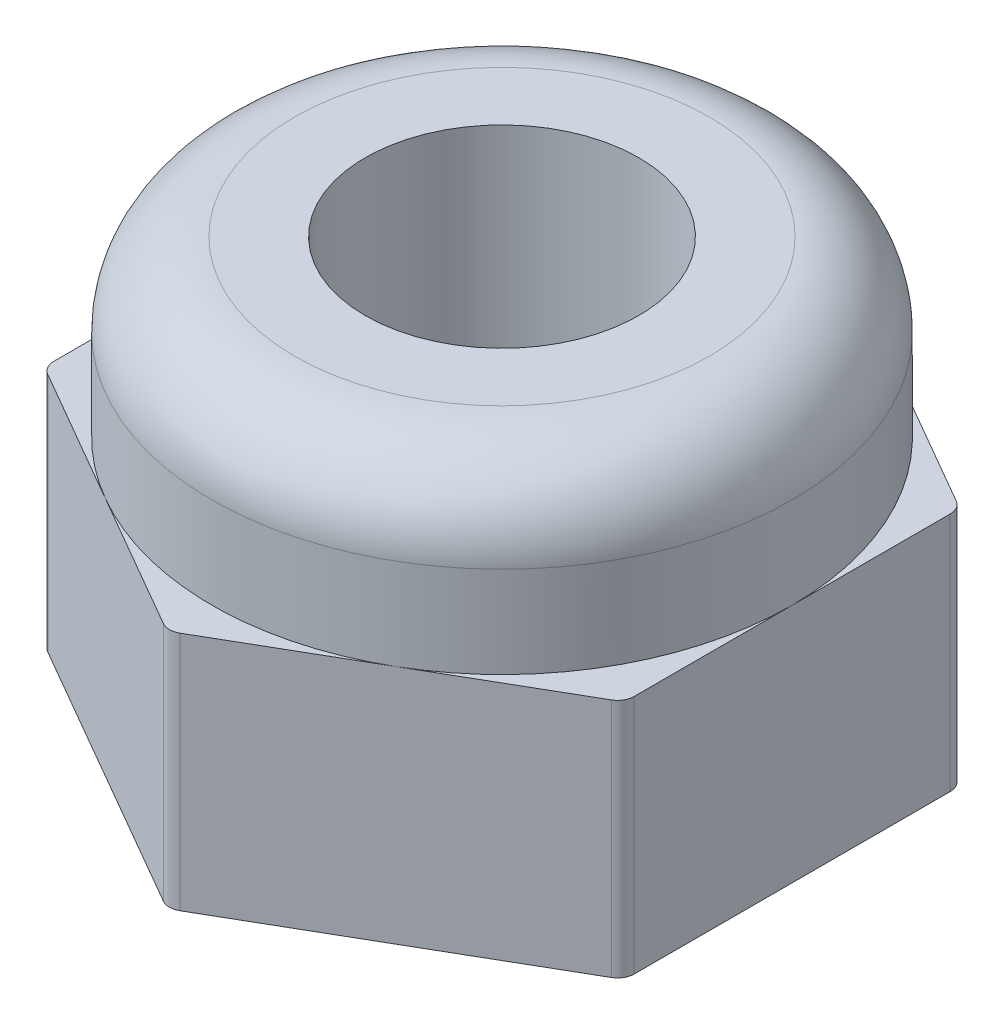
ISO-10303-21;
HEADER;
FILE_DESCRIPTION(('STEP AP214'),'2;1');
FILE_NAME('part.step','',(''),(''),'','','');
FILE_SCHEMA(('AUTOMOTIVE_DESIGN { 1 0 10303 214 1 1 1 1 }'));
ENDSEC;
DATA;
#1=APPLICATION_CONTEXT('core data for automotive mechanical design processes');
#2=APPLICATION_PROTOCOL_DEFINITION('international standard','automotive_design',2000,#1);
#3=PRODUCT_CONTEXT('',#1,'mechanical');
#4=PRODUCT('Part','Part','',(#3));
#5=PRODUCT_RELATED_PRODUCT_CATEGORY('part','',(#4));
#6=PRODUCT_DEFINITION_FORMATION('','',#4);
#7=PRODUCT_DEFINITION_CONTEXT('part definition',#1,'design');
#8=PRODUCT_DEFINITION('design','',#6,#7);
#9=PRODUCT_DEFINITION_SHAPE('','',#8);
#10=(LENGTH_UNIT() NAMED_UNIT(*) SI_UNIT(.MILLI.,.METRE.));
#11=(NAMED_UNIT(*) PLANE_ANGLE_UNIT() SI_UNIT($,.RADIAN.));
#12=(NAMED_UNIT(*) SI_UNIT($,.STERADIAN.) SOLID_ANGLE_UNIT());
#13=UNCERTAINTY_MEASURE_WITH_UNIT(LENGTH_MEASURE(1.E-05),#10,'distance_accuracy_value','');
#14=(GEOMETRIC_REPRESENTATION_CONTEXT(3) GLOBAL_UNCERTAINTY_ASSIGNED_CONTEXT((#13)) GLOBAL_UNIT_ASSIGNED_CONTEXT((#10,
#11,#12)) REPRESENTATION_CONTEXT('',''));
#15=CARTESIAN_POINT('',(0.,0.,0.));
#16=DIRECTION('',(0.,0.,1.));
#17=DIRECTION('',(1.,0.,0.));
#18=AXIS2_PLACEMENT_3D('',#15,#16,#17);
#19=CARTESIAN_POINT('',(0.,2.9,0.));
#20=DIRECTION('',(0.,1.,0.));
#21=DIRECTION('',(0.,0.,1.));
#22=AXIS2_PLACEMENT_3D('',#19,#20,#21);
#23=PLANE('',#22);
#24=DIRECTION('',(0.866025403784439,0.,-0.5));
#25=VECTOR('',#24,1.);
#26=CARTESIAN_POINT('',(0.,2.9,4.04145188432738));
#27=LINE('',#26,#25);
#28=CARTESIAN_POINT('',(1.75,2.9,3.03108891324554));
#29=VERTEX_POINT('',#28);
#30=CARTESIAN_POINT('',(3.4,2.9,2.07846096908265));
#31=VERTEX_POINT('',#30);
#32=EDGE_CURVE('E165',#29,#31,#27,.T.);
#33=ORIENTED_EDGE('',*,*,#32,.T.);
#34=CARTESIAN_POINT('',(3.3,2.9,1.90525588832577));
#35=DIRECTION('',(0.,1.,0.));
#36=DIRECTION('',(0.,0.,1.));
#37=AXIS2_PLACEMENT_3D('',#34,#35,#36);
#38=CIRCLE('',#37,0.2);
#39=CARTESIAN_POINT('',(3.5,2.9,1.90525588832577));
#40=VERTEX_POINT('',#39);
#41=EDGE_CURVE('E309',#31,#40,#38,.T.);
#42=ORIENTED_EDGE('',*,*,#41,.T.);
#43=DIRECTION('',(0.,0.,-1.));
#44=VECTOR('',#43,1.);
#45=CARTESIAN_POINT('',(3.5,2.9,2.02072594216369));
#46=LINE('',#45,#44);
#47=CARTESIAN_POINT('',(3.5,2.9,0.));
#48=VERTEX_POINT('',#47);
#49=EDGE_CURVE('E180',#40,#48,#46,.T.);
#50=ORIENTED_EDGE('',*,*,#49,.T.);
#51=CARTESIAN_POINT('',(0.,2.9,0.));
#52=DIRECTION('',(0.,1.,0.));
#53=DIRECTION('',(0.,0.,1.));
#54=AXIS2_PLACEMENT_3D('',#51,#52,#53);
#55=CIRCLE('',#54,3.5);
#56=EDGE_CURVE('E178',#29,#48,#55,.T.);
#57=ORIENTED_EDGE('',*,*,#56,.F.);
#58=EDGE_LOOP('',(#33,#42,#50,#57));
#59=FACE_BOUND('',#58,.T.);
#60=ADVANCED_FACE('F45',(#59),#23,.T.);
#61=CARTESIAN_POINT('',(3.5,2.9,-1.90525588832576));
#62=VERTEX_POINT('',#61);
#63=EDGE_CURVE('E164',#48,#62,#46,.T.);
#64=ORIENTED_EDGE('',*,*,#63,.T.);
#65=CARTESIAN_POINT('',(3.3,2.9,-1.90525588832576));
#66=DIRECTION('',(0.,1.,0.));
#67=DIRECTION('',(0.,0.,1.));
#68=AXIS2_PLACEMENT_3D('',#65,#66,#67);
#69=CIRCLE('',#68,0.2);
#70=CARTESIAN_POINT('',(3.4,2.9,-2.07846096908265));
#71=VERTEX_POINT('',#70);
#72=EDGE_CURVE('E301',#62,#71,#69,.T.);
#73=ORIENTED_EDGE('',*,*,#72,.T.);
#74=DIRECTION('',(-0.866025403784439,0.,-0.5));
#75=VECTOR('',#74,1.);
#76=CARTESIAN_POINT('',(3.5,2.9,-2.02072594216369));
#77=LINE('',#76,#75);
#78=CARTESIAN_POINT('',(1.75,2.9,-3.03108891324554));
#79=VERTEX_POINT('',#78);
#80=EDGE_CURVE('E206',#71,#79,#77,.T.);
#81=ORIENTED_EDGE('',*,*,#80,.T.);
#82=EDGE_CURVE('E186',#48,#79,#55,.T.);
#83=ORIENTED_EDGE('',*,*,#82,.F.);
#84=EDGE_LOOP('',(#64,#73,#81,#83));
#85=FACE_BOUND('',#84,.T.);
#86=ADVANCED_FACE('F372',(#85),#23,.T.);
#87=CARTESIAN_POINT('',(0.099999999999999,2.9,-3.98371685740842));
#88=VERTEX_POINT('',#87);
#89=EDGE_CURVE('E205',#79,#88,#77,.T.);
#90=ORIENTED_EDGE('',*,*,#89,.T.);
#91=CARTESIAN_POINT('',(0.,2.9,-3.81051177665153));
#92=DIRECTION('',(0.,1.,0.));
#93=DIRECTION('',(0.,0.,1.));
#94=AXIS2_PLACEMENT_3D('',#91,#92,#93);
#95=CIRCLE('',#94,0.2);
#96=CARTESIAN_POINT('',(-0.100000000000001,2.9,-3.98371685740842));
#97=VERTEX_POINT('',#96);
#98=EDGE_CURVE('E291',#88,#97,#95,.T.);
#99=ORIENTED_EDGE('',*,*,#98,.T.);
#100=DIRECTION('',(-0.866025403784439,0.,0.5));
#101=VECTOR('',#100,1.);
#102=CARTESIAN_POINT('',(0.,2.9,-4.04145188432738));
#103=LINE('',#102,#101);
#104=CARTESIAN_POINT('',(-1.75,2.9,-3.03108891324554));
#105=VERTEX_POINT('',#104);
#106=EDGE_CURVE('E210',#97,#105,#103,.T.);
#107=ORIENTED_EDGE('',*,*,#106,.T.);
#108=EDGE_CURVE('E328',#79,#105,#55,.T.);
#109=ORIENTED_EDGE('',*,*,#108,.F.);
#110=EDGE_LOOP('',(#90,#99,#107,#109));
#111=FACE_BOUND('',#110,.T.);
#112=ADVANCED_FACE('F386',(#111),#23,.T.);
#113=CARTESIAN_POINT('',(-3.4,2.9,-2.07846096908265));
#114=VERTEX_POINT('',#113);
#115=EDGE_CURVE('E209',#105,#114,#103,.T.);
#116=ORIENTED_EDGE('',*,*,#115,.T.);
#117=CARTESIAN_POINT('',(-3.3,2.9,-1.90525588832577));
#118=DIRECTION('',(0.,1.,0.));
#119=DIRECTION('',(0.,0.,1.));
#120=AXIS2_PLACEMENT_3D('',#117,#118,#119);
#121=CIRCLE('',#120,0.2);
#122=CARTESIAN_POINT('',(-3.5,2.9,-1.90525588832577));
#123=VERTEX_POINT('',#122);
#124=EDGE_CURVE('E281',#114,#123,#121,.T.);
#125=ORIENTED_EDGE('',*,*,#124,.T.);
#126=DIRECTION('',(0.,0.,1.));
#127=VECTOR('',#126,1.);
#128=CARTESIAN_POINT('',(-3.5,2.9,-2.02072594216369));
#129=LINE('',#128,#127);
#130=CARTESIAN_POINT('',(-3.5,2.9,0.));
#131=VERTEX_POINT('',#130);
#132=EDGE_CURVE('E214',#123,#131,#129,.T.);
#133=ORIENTED_EDGE('',*,*,#132,.T.);
#134=EDGE_CURVE('E197',#105,#131,#55,.T.);
#135=ORIENTED_EDGE('',*,*,#134,.F.);
#136=EDGE_LOOP('',(#116,#125,#133,#135));
#137=FACE_BOUND('',#136,.T.);
#138=ADVANCED_FACE('F335',(#137),#23,.T.);
#139=CARTESIAN_POINT('',(-3.5,2.9,1.90525588832576));
#140=VERTEX_POINT('',#139);
#141=EDGE_CURVE('E213',#131,#140,#129,.T.);
#142=ORIENTED_EDGE('',*,*,#141,.T.);
#143=CARTESIAN_POINT('',(-3.3,2.9,1.90525588832576));
#144=DIRECTION('',(0.,1.,0.));
#145=DIRECTION('',(0.,0.,1.));
#146=AXIS2_PLACEMENT_3D('',#143,#144,#145);
#147=CIRCLE('',#146,0.2);
#148=CARTESIAN_POINT('',(-3.4,2.9,2.07846096908265));
#149=VERTEX_POINT('',#148);
#150=EDGE_CURVE('E11',#140,#149,#147,.T.);
#151=ORIENTED_EDGE('',*,*,#150,.T.);
#152=DIRECTION('',(0.866025403784439,0.,0.5));
#153=VECTOR('',#152,1.);
#154=CARTESIAN_POINT('',(-3.5,2.9,2.02072594216369));
#155=LINE('',#154,#153);
#156=CARTESIAN_POINT('',(-1.75,2.9,3.03108891324554));
#157=VERTEX_POINT('',#156);
#158=EDGE_CURVE('E218',#149,#157,#155,.T.);
#159=ORIENTED_EDGE('',*,*,#158,.T.);
#160=EDGE_CURVE('E192',#131,#157,#55,.T.);
#161=ORIENTED_EDGE('',*,*,#160,.F.);
#162=EDGE_LOOP('',(#142,#151,#159,#161));
#163=FACE_BOUND('',#162,.T.);
#164=ADVANCED_FACE('F352',(#163),#23,.T.);
#165=CARTESIAN_POINT('',(0.,2.9,4.04145188432738));
#166=DIRECTION('',(-0.5,0.,-0.866025403784439));
#167=DIRECTION('',(-0.866025403784439,0.,0.5));
#168=AXIS2_PLACEMENT_3D('',#165,#166,#167);
#169=PLANE('',#168);
#170=DIRECTION('',(0.866025403784439,0.,-0.5));
#171=VECTOR('',#170,1.);
#172=CARTESIAN_POINT('',(0.,0.,4.04145188432738));
#173=LINE('',#172,#171);
#174=CARTESIAN_POINT('',(0.0999999999999998,0.,3.98371685740842));
#175=VERTEX_POINT('',#174);
#176=CARTESIAN_POINT('',(3.4,0.,2.07846096908265));
#177=VERTEX_POINT('',#176);
#178=EDGE_CURVE('E185',#175,#177,#173,.T.);
#179=ORIENTED_EDGE('',*,*,#178,.T.);
#180=DIRECTION('',(0.,-1.,0.));
#181=VECTOR('',#180,1.);
#182=CARTESIAN_POINT('',(3.4,2.9,2.07846096908265));
#183=LINE('',#182,#181);
#184=EDGE_CURVE('E172',#177,#31,#183,.F.);
#185=ORIENTED_EDGE('',*,*,#184,.T.);
#186=ORIENTED_EDGE('',*,*,#32,.F.);
#187=CARTESIAN_POINT('',(0.0999999999999998,2.9,3.98371685740842));
#188=VERTEX_POINT('',#187);
#189=EDGE_CURVE('E154',#188,#29,#27,.T.);
#190=ORIENTED_EDGE('',*,*,#189,.F.);
#191=DIRECTION('',(0.,-1.,0.));
#192=VECTOR('',#191,1.);
#193=CARTESIAN_POINT('',(0.0999999999999998,2.9,3.98371685740842));
#194=LINE('',#193,#192);
#195=EDGE_CURVE('E304',#188,#175,#194,.T.);
#196=ORIENTED_EDGE('',*,*,#195,.T.);
#197=EDGE_LOOP('',(#179,#185,#186,#190,#196));
#198=FACE_BOUND('',#197,.T.);
#199=ADVANCED_FACE('F170',(#198),#169,.F.);
#200=CARTESIAN_POINT('',(3.5,2.9,2.02072594216369));
#201=DIRECTION('',(-1.,0.,0.));
#202=DIRECTION('',(0.,0.,1.));
#203=AXIS2_PLACEMENT_3D('',#200,#201,#202);
#204=PLANE('',#203);
#205=DIRECTION('',(0.,0.,-1.));
#206=VECTOR('',#205,1.);
#207=CARTESIAN_POINT('',(3.5,0.,2.02072594216369));
#208=LINE('',#207,#206);
#209=CARTESIAN_POINT('',(3.5,0.,1.90525588832577));
#210=VERTEX_POINT('',#209);
#211=CARTESIAN_POINT('',(3.5,0.,-1.90525588832576));
#212=VERTEX_POINT('',#211);
#213=EDGE_CURVE('E224',#210,#212,#208,.T.);
#214=ORIENTED_EDGE('',*,*,#213,.T.);
#215=DIRECTION('',(0.,-1.,0.));
#216=VECTOR('',#215,1.);
#217=CARTESIAN_POINT('',(3.5,2.9,-1.90525588832576));
#218=LINE('',#217,#216);
#219=EDGE_CURVE('E298',#212,#62,#218,.F.);
#220=ORIENTED_EDGE('',*,*,#219,.T.);
#221=ORIENTED_EDGE('',*,*,#63,.F.);
#222=ORIENTED_EDGE('',*,*,#49,.F.);
#223=DIRECTION('',(0.,-1.,0.));
#224=VECTOR('',#223,1.);
#225=CARTESIAN_POINT('',(3.5,2.9,1.90525588832577));
#226=LINE('',#225,#224);
#227=EDGE_CURVE('E294',#40,#210,#226,.T.);
#228=ORIENTED_EDGE('',*,*,#227,.T.);
#229=EDGE_LOOP('',(#214,#220,#221,#222,#228));
#230=FACE_BOUND('',#229,.T.);
#231=ADVANCED_FACE('F367',(#230),#204,.F.);
#232=CARTESIAN_POINT('',(3.5,2.9,-2.02072594216369));
#233=DIRECTION('',(-0.5,0.,0.866025403784439));
#234=DIRECTION('',(0.866025403784439,0.,0.5));
#235=AXIS2_PLACEMENT_3D('',#232,#233,#234);
#236=PLANE('',#235);
#237=DIRECTION('',(-0.866025403784439,0.,-0.5));
#238=VECTOR('',#237,1.);
#239=CARTESIAN_POINT('',(3.5,0.,-2.02072594216369));
#240=LINE('',#239,#238);
#241=CARTESIAN_POINT('',(3.4,0.,-2.07846096908265));
#242=VERTEX_POINT('',#241);
#243=CARTESIAN_POINT('',(0.099999999999999,0.,-3.98371685740842));
#244=VERTEX_POINT('',#243);
#245=EDGE_CURVE('E228',#242,#244,#240,.T.);
#246=ORIENTED_EDGE('',*,*,#245,.T.);
#247=DIRECTION('',(0.,-1.,0.));
#248=VECTOR('',#247,1.);
#249=CARTESIAN_POINT('',(0.099999999999999,2.9,-3.98371685740842));
#250=LINE('',#249,#248);
#251=EDGE_CURVE('E288',#244,#88,#250,.F.);
#252=ORIENTED_EDGE('',*,*,#251,.T.);
#253=ORIENTED_EDGE('',*,*,#89,.F.);
#254=ORIENTED_EDGE('',*,*,#80,.F.);
#255=DIRECTION('',(0.,-1.,0.));
#256=VECTOR('',#255,1.);
#257=CARTESIAN_POINT('',(3.4,2.9,-2.07846096908265));
#258=LINE('',#257,#256);
#259=EDGE_CURVE('E284',#71,#242,#258,.T.);
#260=ORIENTED_EDGE('',*,*,#259,.T.);
#261=EDGE_LOOP('',(#246,#252,#253,#254,#260));
#262=FACE_BOUND('',#261,.T.);
#263=ADVANCED_FACE('F379',(#262),#236,.F.);
#264=CARTESIAN_POINT('',(0.,2.9,-4.04145188432738));
#265=DIRECTION('',(0.5,0.,0.866025403784439));
#266=DIRECTION('',(0.866025403784439,0.,-0.5));
#267=AXIS2_PLACEMENT_3D('',#264,#265,#266);
#268=PLANE('',#267);
#269=DIRECTION('',(-0.866025403784439,0.,0.5));
#270=VECTOR('',#269,1.);
#271=CARTESIAN_POINT('',(0.,0.,-4.04145188432738));
#272=LINE('',#271,#270);
#273=CARTESIAN_POINT('',(-0.100000000000001,0.,-3.98371685740842));
#274=VERTEX_POINT('',#273);
#275=CARTESIAN_POINT('',(-3.4,0.,-2.07846096908265));
#276=VERTEX_POINT('',#275);
#277=EDGE_CURVE('E232',#274,#276,#272,.T.);
#278=ORIENTED_EDGE('',*,*,#277,.T.);
#279=DIRECTION('',(0.,-1.,0.));
#280=VECTOR('',#279,1.);
#281=CARTESIAN_POINT('',(-3.4,2.9,-2.07846096908265));
#282=LINE('',#281,#280);
#283=EDGE_CURVE('E278',#276,#114,#282,.F.);
#284=ORIENTED_EDGE('',*,*,#283,.T.);
#285=ORIENTED_EDGE('',*,*,#115,.F.);
#286=ORIENTED_EDGE('',*,*,#106,.F.);
#287=DIRECTION('',(0.,-1.,0.));
#288=VECTOR('',#287,1.);
#289=CARTESIAN_POINT('',(-0.100000000000001,2.9,-3.98371685740842));
#290=LINE('',#289,#288);
#291=EDGE_CURVE('E274',#97,#274,#290,.T.);
#292=ORIENTED_EDGE('',*,*,#291,.T.);
#293=EDGE_LOOP('',(#278,#284,#285,#286,#292));
#294=FACE_BOUND('',#293,.T.);
#295=ADVANCED_FACE('F340',(#294),#268,.F.);
#296=CARTESIAN_POINT('',(-3.5,2.9,-2.02072594216369));
#297=DIRECTION('',(1.,0.,0.));
#298=DIRECTION('',(0.,0.,-1.));
#299=AXIS2_PLACEMENT_3D('',#296,#297,#298);
#300=PLANE('',#299);
#301=ORIENTED_EDGE('',*,*,#132,.F.);
#302=DIRECTION('',(0.,-1.,0.));
#303=VECTOR('',#302,1.);
#304=CARTESIAN_POINT('',(-3.5,2.9,-1.90525588832577));
#305=LINE('',#304,#303);
#306=CARTESIAN_POINT('',(-3.5,0.,-1.90525588832577));
#307=VERTEX_POINT('',#306);
#308=EDGE_CURVE('E252',#123,#307,#305,.T.);
#309=ORIENTED_EDGE('',*,*,#308,.T.);
#310=DIRECTION('',(0.,0.,1.));
#311=VECTOR('',#310,1.);
#312=CARTESIAN_POINT('',(-3.5,0.,-2.02072594216369));
#313=LINE('',#312,#311);
#314=CARTESIAN_POINT('',(-3.5,0.,1.90525588832576));
#315=VERTEX_POINT('',#314);
#316=EDGE_CURVE('E236',#307,#315,#313,.T.);
#317=ORIENTED_EDGE('',*,*,#316,.T.);
#318=DIRECTION('',(0.,-1.,0.));
#319=VECTOR('',#318,1.);
#320=CARTESIAN_POINT('',(-3.5,2.9,1.90525588832576));
#321=LINE('',#320,#319);
#322=EDGE_CURVE('E249',#315,#140,#321,.F.);
#323=ORIENTED_EDGE('',*,*,#322,.T.);
#324=ORIENTED_EDGE('',*,*,#141,.F.);
#325=EDGE_LOOP('',(#301,#309,#317,#323,#324));
#326=FACE_BOUND('',#325,.T.);
#327=ADVANCED_FACE('F349',(#326),#300,.F.);
#328=CARTESIAN_POINT('',(-3.5,2.9,2.02072594216369));
#329=DIRECTION('',(0.5,0.,-0.866025403784439));
#330=DIRECTION('',(-0.866025403784439,0.,-0.5));
#331=AXIS2_PLACEMENT_3D('',#328,#329,#330);
#332=PLANE('',#331);
#333=DIRECTION('',(0.866025403784439,0.,0.5));
#334=VECTOR('',#333,1.);
#335=CARTESIAN_POINT('',(-3.5,0.,2.02072594216369));
#336=LINE('',#335,#334);
#337=CARTESIAN_POINT('',(-3.4,0.,2.07846096908265));
#338=VERTEX_POINT('',#337);
#339=CARTESIAN_POINT('',(-0.0999999999999985,0.,3.98371685740842));
#340=VERTEX_POINT('',#339);
#341=EDGE_CURVE('E176',#338,#340,#336,.T.);
#342=ORIENTED_EDGE('',*,*,#341,.T.);
#343=DIRECTION('',(0.,-1.,0.));
#344=VECTOR('',#343,1.);
#345=CARTESIAN_POINT('',(-0.1,2.9,3.98371685740842));
#346=LINE('',#345,#344);
#347=CARTESIAN_POINT('',(-0.0999999999999985,2.9,3.98371685740842));
#348=VERTEX_POINT('',#347);
#349=EDGE_CURVE('E67',#340,#348,#346,.F.);
#350=ORIENTED_EDGE('',*,*,#349,.T.);
#351=EDGE_CURVE('E217',#157,#348,#155,.T.);
#352=ORIENTED_EDGE('',*,*,#351,.F.);
#353=ORIENTED_EDGE('',*,*,#158,.F.);
#354=DIRECTION('',(0.,-1.,0.));
#355=VECTOR('',#354,1.);
#356=CARTESIAN_POINT('',(-3.4,2.9,2.07846096908265));
#357=LINE('',#356,#355);
#358=EDGE_CURVE('E312',#149,#338,#357,.T.);
#359=ORIENTED_EDGE('',*,*,#358,.T.);
#360=EDGE_LOOP('',(#342,#350,#352,#353,#359));
#361=FACE_BOUND('',#360,.T.);
#362=ADVANCED_FACE('F356',(#361),#332,.F.);
#363=ORIENTED_EDGE('',*,*,#351,.T.);
#364=CARTESIAN_POINT('',(0.,2.9,3.81051177665153));
#365=DIRECTION('',(0.,1.,0.));
#366=DIRECTION('',(0.,0.,1.));
#367=AXIS2_PLACEMENT_3D('',#364,#365,#366);
#368=CIRCLE('',#367,0.2);
#369=EDGE_CURVE('E54',#348,#188,#368,.T.);
#370=ORIENTED_EDGE('',*,*,#369,.T.);
#371=ORIENTED_EDGE('',*,*,#189,.T.);
#372=EDGE_CURVE('E158',#157,#29,#55,.T.);
#373=ORIENTED_EDGE('',*,*,#372,.F.);
#374=EDGE_LOOP('',(#363,#370,#371,#373));
#375=FACE_BOUND('',#374,.T.);
#376=ADVANCED_FACE('F156',(#375),#23,.T.);
#377=CARTESIAN_POINT('',(0.,0.,0.));
#378=DIRECTION('',(0.,1.,0.));
#379=DIRECTION('',(0.,0.,1.));
#380=AXIS2_PLACEMENT_3D('',#377,#378,#379);
#381=PLANE('',#380);
#382=CARTESIAN_POINT('',(0.,0.,0.));
#383=DIRECTION('',(0.,-1.,0.));
#384=DIRECTION('',(0.,0.,-1.));
#385=AXIS2_PLACEMENT_3D('',#382,#383,#384);
#386=CIRCLE('',#385,1.64999999999999);
#387=CARTESIAN_POINT('',(0.,0.,-1.64999999999999));
#388=VERTEX_POINT('',#387);
#389=EDGE_CURVE('E199',#388,#388,#386,.T.);
#390=ORIENTED_EDGE('',*,*,#389,.F.);
#391=EDGE_LOOP('',(#390));
#392=FACE_BOUND('',#391,.T.);
#393=ORIENTED_EDGE('',*,*,#316,.F.);
#394=CARTESIAN_POINT('',(-3.3,0.,-1.90525588832577));
#395=DIRECTION('',(0.,1.,0.));
#396=DIRECTION('',(0.,0.,1.));
#397=AXIS2_PLACEMENT_3D('',#394,#395,#396);
#398=CIRCLE('',#397,0.2);
#399=EDGE_CURVE('E271',#307,#276,#398,.F.);
#400=ORIENTED_EDGE('',*,*,#399,.T.);
#401=ORIENTED_EDGE('',*,*,#277,.F.);
#402=CARTESIAN_POINT('',(0.,0.,-3.81051177665153));
#403=DIRECTION('',(0.,1.,0.));
#404=DIRECTION('',(0.,0.,1.));
#405=AXIS2_PLACEMENT_3D('',#402,#403,#404);
#406=CIRCLE('',#405,0.2);
#407=EDGE_CURVE('E268',#274,#244,#406,.F.);
#408=ORIENTED_EDGE('',*,*,#407,.T.);
#409=ORIENTED_EDGE('',*,*,#245,.F.);
#410=CARTESIAN_POINT('',(3.3,0.,-1.90525588832576));
#411=DIRECTION('',(0.,1.,0.));
#412=DIRECTION('',(0.,0.,1.));
#413=AXIS2_PLACEMENT_3D('',#410,#411,#412);
#414=CIRCLE('',#413,0.2);
#415=EDGE_CURVE('E265',#242,#212,#414,.F.);
#416=ORIENTED_EDGE('',*,*,#415,.T.);
#417=ORIENTED_EDGE('',*,*,#213,.F.);
#418=CARTESIAN_POINT('',(3.3,0.,1.90525588832577));
#419=DIRECTION('',(0.,1.,0.));
#420=DIRECTION('',(0.,0.,1.));
#421=AXIS2_PLACEMENT_3D('',#418,#419,#420);
#422=CIRCLE('',#421,0.2);
#423=EDGE_CURVE('E262',#210,#177,#422,.F.);
#424=ORIENTED_EDGE('',*,*,#423,.T.);
#425=ORIENTED_EDGE('',*,*,#178,.F.);
#426=CARTESIAN_POINT('',(0.,0.,3.81051177665153));
#427=DIRECTION('',(0.,1.,0.));
#428=DIRECTION('',(0.,0.,1.));
#429=AXIS2_PLACEMENT_3D('',#426,#427,#428);
#430=CIRCLE('',#429,0.2);
#431=EDGE_CURVE('E259',#175,#340,#430,.F.);
#432=ORIENTED_EDGE('',*,*,#431,.T.);
#433=ORIENTED_EDGE('',*,*,#341,.F.);
#434=CARTESIAN_POINT('',(-3.3,0.,1.90525588832576));
#435=DIRECTION('',(0.,1.,0.));
#436=DIRECTION('',(0.,0.,1.));
#437=AXIS2_PLACEMENT_3D('',#434,#435,#436);
#438=CIRCLE('',#437,0.2);
#439=EDGE_CURVE('E256',#338,#315,#438,.F.);
#440=ORIENTED_EDGE('',*,*,#439,.T.);
#441=EDGE_LOOP('',(#393,#400,#401,#408,#409,#416,#417,#424,#425,#432,#433,#440));
#442=FACE_BOUND('',#441,.T.);
#443=ADVANCED_FACE('F358',(#392,#442),#381,.F.);
#444=CARTESIAN_POINT('',(0.,5.,0.));
#445=DIRECTION('',(0.,-1.,0.));
#446=DIRECTION('',(0.,0.,-1.));
#447=AXIS2_PLACEMENT_3D('',#444,#445,#446);
#448=CYLINDRICAL_SURFACE('',#447,3.5);
#449=CARTESIAN_POINT('',(0.,4.,0.));
#450=DIRECTION('',(0.,-1.,0.));
#451=DIRECTION('',(0.,0.,-1.));
#452=AXIS2_PLACEMENT_3D('',#449,#450,#451);
#453=CIRCLE('',#452,3.5);
#454=CARTESIAN_POINT('',(0.,4.,-3.5));
#455=VERTEX_POINT('',#454);
#456=EDGE_CURVE('E221',#455,#455,#453,.T.);
#457=ORIENTED_EDGE('',*,*,#456,.T.);
#458=EDGE_LOOP('',(#457));
#459=FACE_BOUND('',#458,.T.);
#460=ORIENTED_EDGE('',*,*,#372,.T.);
#461=ORIENTED_EDGE('',*,*,#56,.T.);
#462=ORIENTED_EDGE('',*,*,#82,.T.);
#463=ORIENTED_EDGE('',*,*,#108,.T.);
#464=ORIENTED_EDGE('',*,*,#134,.T.);
#465=ORIENTED_EDGE('',*,*,#160,.T.);
#466=EDGE_LOOP('',(#460,#461,#462,#463,#464,#465));
#467=FACE_BOUND('',#466,.T.);
#468=ADVANCED_FACE('F189',(#459,#467),#448,.T.);
#469=CARTESIAN_POINT('',(0.,5.,0.));
#470=DIRECTION('',(0.,-1.,0.));
#471=DIRECTION('',(0.,0.,-1.));
#472=AXIS2_PLACEMENT_3D('',#469,#470,#471);
#473=PLANE('',#472);
#474=CARTESIAN_POINT('',(0.,5.,0.));
#475=DIRECTION('',(0.,-1.,0.));
#476=DIRECTION('',(0.,0.,-1.));
#477=AXIS2_PLACEMENT_3D('',#474,#475,#476);
#478=CIRCLE('',#477,1.64999999999999);
#479=CARTESIAN_POINT('',(0.,5.,-1.64999999999999));
#480=VERTEX_POINT('',#479);
#481=EDGE_CURVE('E194',#480,#480,#478,.T.);
#482=ORIENTED_EDGE('',*,*,#481,.T.);
#483=EDGE_LOOP('',(#482));
#484=FACE_BOUND('',#483,.T.);
#485=CARTESIAN_POINT('',(0.,5.,0.));
#486=DIRECTION('',(0.,-1.,0.));
#487=DIRECTION('',(0.,0.,-1.));
#488=AXIS2_PLACEMENT_3D('',#485,#486,#487);
#489=CIRCLE('',#488,2.5);
#490=CARTESIAN_POINT('',(0.,5.,-2.5));
#491=VERTEX_POINT('',#490);
#492=EDGE_CURVE('E245',#491,#491,#489,.F.);
#493=ORIENTED_EDGE('',*,*,#492,.T.);
#494=EDGE_LOOP('',(#493));
#495=FACE_BOUND('',#494,.T.);
#496=ADVANCED_FACE('F419',(#484,#495),#473,.F.);
#497=CARTESIAN_POINT('',(0.,4.,0.));
#498=DIRECTION('',(0.,-1.,0.));
#499=DIRECTION('',(0.,0.,-1.));
#500=AXIS2_PLACEMENT_3D('',#497,#498,#499);
#501=TOROIDAL_SURFACE('',#500,2.5,1.);
#502=ORIENTED_EDGE('',*,*,#492,.F.);
#503=EDGE_LOOP('',(#502));
#504=FACE_BOUND('',#503,.T.);
#505=ORIENTED_EDGE('',*,*,#456,.F.);
#506=EDGE_LOOP('',(#505));
#507=FACE_BOUND('',#506,.T.);
#508=ADVANCED_FACE('F416',(#504,#507),#501,.T.);
#509=CARTESIAN_POINT('',(-3.3,2.9,-1.90525588832577));
#510=DIRECTION('',(0.,-1.,0.));
#511=DIRECTION('',(0.,0.,-1.));
#512=AXIS2_PLACEMENT_3D('',#509,#510,#511);
#513=CYLINDRICAL_SURFACE('',#512,0.2);
#514=ORIENTED_EDGE('',*,*,#124,.F.);
#515=ORIENTED_EDGE('',*,*,#283,.F.);
#516=ORIENTED_EDGE('',*,*,#399,.F.);
#517=ORIENTED_EDGE('',*,*,#308,.F.);
#518=EDGE_LOOP('',(#514,#515,#516,#517));
#519=FACE_BOUND('',#518,.T.);
#520=ADVANCED_FACE('F345',(#519),#513,.T.);
#521=CARTESIAN_POINT('',(0.,2.9,-3.81051177665153));
#522=DIRECTION('',(0.,-1.,0.));
#523=DIRECTION('',(0.,0.,-1.));
#524=AXIS2_PLACEMENT_3D('',#521,#522,#523);
#525=CYLINDRICAL_SURFACE('',#524,0.2);
#526=ORIENTED_EDGE('',*,*,#98,.F.);
#527=ORIENTED_EDGE('',*,*,#251,.F.);
#528=ORIENTED_EDGE('',*,*,#407,.F.);
#529=ORIENTED_EDGE('',*,*,#291,.F.);
#530=EDGE_LOOP('',(#526,#527,#528,#529));
#531=FACE_BOUND('',#530,.T.);
#532=ADVANCED_FACE('F384',(#531),#525,.T.);
#533=CARTESIAN_POINT('',(3.3,2.9,-1.90525588832576));
#534=DIRECTION('',(0.,-1.,0.));
#535=DIRECTION('',(0.,0.,-1.));
#536=AXIS2_PLACEMENT_3D('',#533,#534,#535);
#537=CYLINDRICAL_SURFACE('',#536,0.2);
#538=ORIENTED_EDGE('',*,*,#72,.F.);
#539=ORIENTED_EDGE('',*,*,#219,.F.);
#540=ORIENTED_EDGE('',*,*,#415,.F.);
#541=ORIENTED_EDGE('',*,*,#259,.F.);
#542=EDGE_LOOP('',(#538,#539,#540,#541));
#543=FACE_BOUND('',#542,.T.);
#544=ADVANCED_FACE('F376',(#543),#537,.T.);
#545=CARTESIAN_POINT('',(3.3,2.9,1.90525588832577));
#546=DIRECTION('',(0.,-1.,0.));
#547=DIRECTION('',(0.,0.,-1.));
#548=AXIS2_PLACEMENT_3D('',#545,#546,#547);
#549=CYLINDRICAL_SURFACE('',#548,0.2);
#550=ORIENTED_EDGE('',*,*,#41,.F.);
#551=ORIENTED_EDGE('',*,*,#184,.F.);
#552=ORIENTED_EDGE('',*,*,#423,.F.);
#553=ORIENTED_EDGE('',*,*,#227,.F.);
#554=EDGE_LOOP('',(#550,#551,#552,#553));
#555=FACE_BOUND('',#554,.T.);
#556=ADVANCED_FACE('F363',(#555),#549,.T.);
#557=CARTESIAN_POINT('',(0.,2.9,3.81051177665153));
#558=DIRECTION('',(0.,-1.,0.));
#559=DIRECTION('',(0.,0.,-1.));
#560=AXIS2_PLACEMENT_3D('',#557,#558,#559);
#561=CYLINDRICAL_SURFACE('',#560,0.2);
#562=ORIENTED_EDGE('',*,*,#369,.F.);
#563=ORIENTED_EDGE('',*,*,#349,.F.);
#564=ORIENTED_EDGE('',*,*,#431,.F.);
#565=ORIENTED_EDGE('',*,*,#195,.F.);
#566=EDGE_LOOP('',(#562,#563,#564,#565));
#567=FACE_BOUND('',#566,.T.);
#568=ADVANCED_FACE('F361',(#567),#561,.T.);
#569=CARTESIAN_POINT('',(-3.3,2.9,1.90525588832576));
#570=DIRECTION('',(0.,-1.,0.));
#571=DIRECTION('',(0.,0.,-1.));
#572=AXIS2_PLACEMENT_3D('',#569,#570,#571);
#573=CYLINDRICAL_SURFACE('',#572,0.2);
#574=ORIENTED_EDGE('',*,*,#150,.F.);
#575=ORIENTED_EDGE('',*,*,#322,.F.);
#576=ORIENTED_EDGE('',*,*,#439,.F.);
#577=ORIENTED_EDGE('',*,*,#358,.F.);
#578=EDGE_LOOP('',(#574,#575,#576,#577));
#579=FACE_BOUND('',#578,.T.);
#580=ADVANCED_FACE('F47',(#579),#573,.T.);
#581=CARTESIAN_POINT('',(0.,0.,0.));
#582=DIRECTION('',(0.,-1.,0.));
#583=DIRECTION('',(0.,0.,-1.));
#584=AXIS2_PLACEMENT_3D('',#581,#582,#583);
#585=CYLINDRICAL_SURFACE('',#584,1.64999999999999);
#586=ORIENTED_EDGE('',*,*,#389,.T.);
#587=EDGE_LOOP('',(#586));
#588=FACE_BOUND('',#587,.T.);
#589=ORIENTED_EDGE('',*,*,#481,.F.);
#590=EDGE_LOOP('',(#589));
#591=FACE_BOUND('',#590,.T.);
#592=ADVANCED_FACE('F432',(#588,#591),#585,.F.);
#593=CLOSED_SHELL('',(#60,#86,#112,#138,#164,#199,#231,#263,#295,#327,#362,#376,#443,#468,#496,
#508,#520,#532,#544,#556,#568,#580,#592));
#594=MANIFOLD_SOLID_BREP('B2',#593);
#595=ADVANCED_BREP_SHAPE_REPRESENTATION('',(#18,#594),#14);
#596=SHAPE_DEFINITION_REPRESENTATION(#9,#595);
ENDSEC;
END-ISO-10303-21;
